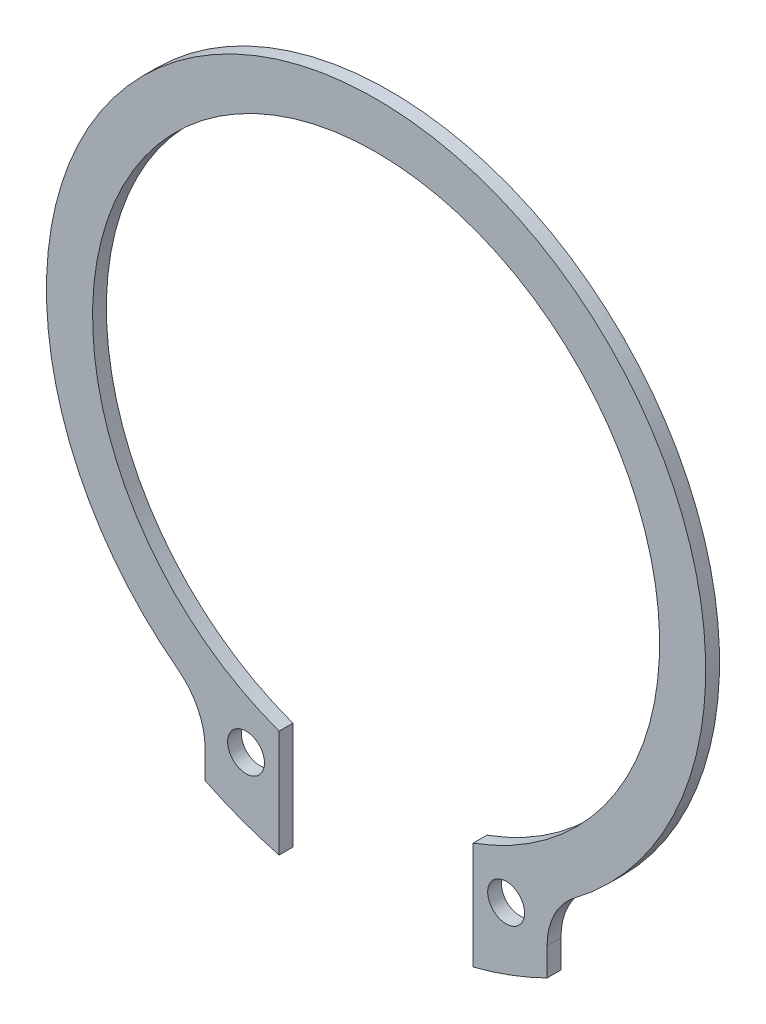
ISO-10303-21;
HEADER;
FILE_DESCRIPTION(('STEP AP214'),'2;1');
FILE_NAME('part.step','',(''),(''),'','','');
FILE_SCHEMA(('AUTOMOTIVE_DESIGN { 1 0 10303 214 1 1 1 1 }'));
ENDSEC;
DATA;
#1=APPLICATION_CONTEXT('core data for automotive mechanical design processes');
#2=APPLICATION_PROTOCOL_DEFINITION('international standard','automotive_design',2000,#1);
#3=PRODUCT_CONTEXT('',#1,'mechanical');
#4=PRODUCT('Part','Part','',(#3));
#5=PRODUCT_RELATED_PRODUCT_CATEGORY('part','',(#4));
#6=PRODUCT_DEFINITION_FORMATION('','',#4);
#7=PRODUCT_DEFINITION_CONTEXT('part definition',#1,'design');
#8=PRODUCT_DEFINITION('design','',#6,#7);
#9=PRODUCT_DEFINITION_SHAPE('','',#8);
#10=(LENGTH_UNIT() NAMED_UNIT(*) SI_UNIT(.MILLI.,.METRE.));
#11=(NAMED_UNIT(*) PLANE_ANGLE_UNIT() SI_UNIT($,.RADIAN.));
#12=(NAMED_UNIT(*) SI_UNIT($,.STERADIAN.) SOLID_ANGLE_UNIT());
#13=UNCERTAINTY_MEASURE_WITH_UNIT(LENGTH_MEASURE(1.E-05),#10,'distance_accuracy_value','');
#14=(GEOMETRIC_REPRESENTATION_CONTEXT(3) GLOBAL_UNCERTAINTY_ASSIGNED_CONTEXT((#13)) GLOBAL_UNIT_ASSIGNED_CONTEXT((#10,
#11,#12)) REPRESENTATION_CONTEXT('',''));
#15=CARTESIAN_POINT('',(0.,0.,0.));
#16=DIRECTION('',(0.,0.,1.));
#17=DIRECTION('',(1.,0.,0.));
#18=AXIS2_PLACEMENT_3D('',#15,#16,#17);
#19=CARTESIAN_POINT('',(-52.0911801090187,-69.0562014221009,3.));
#20=DIRECTION('',(0.,0.,1.));
#21=DIRECTION('',(1.,0.,0.));
#22=AXIS2_PLACEMENT_3D('',#19,#20,#21);
#23=PLANE('',#22);
#24=CARTESIAN_POINT('',(-28.2027034477095,-65.3715453780829,3.));
#25=DIRECTION('',(0.,0.,1.));
#26=DIRECTION('',(1.,0.,0.));
#27=AXIS2_PLACEMENT_3D('',#24,#25,#26);
#28=CIRCLE('',#27,4.);
#29=CARTESIAN_POINT('',(-24.2027034477095,-65.3715453780829,3.));
#30=VERTEX_POINT('',#29);
#31=EDGE_CURVE('E148',#30,#30,#28,.T.);
#32=ORIENTED_EDGE('',*,*,#31,.F.);
#33=EDGE_LOOP('',(#32));
#34=FACE_BOUND('',#33,.T.);
#35=CARTESIAN_POINT('',(-52.0911801090187,-69.0562014221009,3.));
#36=DIRECTION('',(0.,0.,-1.));
#37=DIRECTION('',(1.,0.,0.));
#38=AXIS2_PLACEMENT_3D('',#35,#36,#37);
#39=CIRCLE('',#38,15.);
#40=CARTESIAN_POINT('',(-43.0580274889577,-57.0811375916787,3.));
#41=VERTEX_POINT('',#40);
#42=CARTESIAN_POINT('',(-37.0911801090187,-69.0562014221009,3.));
#43=VERTEX_POINT('',#42);
#44=EDGE_CURVE('E163',#41,#43,#39,.T.);
#45=ORIENTED_EDGE('',*,*,#44,.T.);
#46=DIRECTION('',(0.,-1.,0.));
#47=VECTOR('',#46,1.);
#48=CARTESIAN_POINT('',(-37.0911801090187,-75.0960801482049,3.));
#49=LINE('',#48,#47);
#50=CARTESIAN_POINT('',(-37.0911801090187,-75.0960801482049,3.));
#51=VERTEX_POINT('',#50);
#52=EDGE_CURVE('E101',#43,#51,#49,.T.);
#53=ORIENTED_EDGE('',*,*,#52,.T.);
#54=CARTESIAN_POINT('',(0.,0.,3.));
#55=DIRECTION('',(0.,0.,1.));
#56=DIRECTION('',(-1.,0.,0.));
#57=AXIS2_PLACEMENT_3D('',#54,#55,#56);
#58=CIRCLE('',#57,83.7566528432535);
#59=CARTESIAN_POINT('',(-21.0342388145287,-81.0724225183796,3.));
#60=VERTEX_POINT('',#59);
#61=EDGE_CURVE('E184',#51,#60,#58,.T.);
#62=ORIENTED_EDGE('',*,*,#61,.T.);
#63=DIRECTION('',(0.,1.,0.));
#64=VECTOR('',#63,1.);
#65=CARTESIAN_POINT('',(-21.0342388145287,-57.7910961783334,3.));
#66=LINE('',#65,#64);
#67=CARTESIAN_POINT('',(-21.0342388145287,-57.7910961783334,3.));
#68=VERTEX_POINT('',#67);
#69=EDGE_CURVE('E203',#60,#68,#66,.T.);
#70=ORIENTED_EDGE('',*,*,#69,.T.);
#71=CARTESIAN_POINT('',(0.,0.,3.));
#72=DIRECTION('',(0.,0.,-1.));
#73=DIRECTION('',(1.,0.,0.));
#74=AXIS2_PLACEMENT_3D('',#71,#72,#73);
#75=CIRCLE('',#74,61.5);
#76=CARTESIAN_POINT('',(21.0342388145286,-57.7910961783334,3.));
#77=VERTEX_POINT('',#76);
#78=EDGE_CURVE('E200',#68,#77,#75,.T.);
#79=ORIENTED_EDGE('',*,*,#78,.T.);
#80=DIRECTION('',(0.,-1.,0.));
#81=VECTOR('',#80,1.);
#82=CARTESIAN_POINT('',(21.0342388145287,-57.7910961783334,3.));
#83=LINE('',#82,#81);
#84=CARTESIAN_POINT('',(21.0342388145287,-81.0724225183796,3.));
#85=VERTEX_POINT('',#84);
#86=EDGE_CURVE('E202',#77,#85,#83,.T.);
#87=ORIENTED_EDGE('',*,*,#86,.T.);
#88=CARTESIAN_POINT('',(0.,0.,3.));
#89=DIRECTION('',(0.,0.,1.));
#90=DIRECTION('',(1.,0.,0.));
#91=AXIS2_PLACEMENT_3D('',#88,#89,#90);
#92=CIRCLE('',#91,83.7566528432535);
#93=CARTESIAN_POINT('',(37.0911801090187,-75.0960801482049,3.));
#94=VERTEX_POINT('',#93);
#95=EDGE_CURVE('E126',#85,#94,#92,.T.);
#96=ORIENTED_EDGE('',*,*,#95,.T.);
#97=DIRECTION('',(0.,1.,0.));
#98=VECTOR('',#97,1.);
#99=CARTESIAN_POINT('',(37.0911801090187,-75.0960801482049,3.));
#100=LINE('',#99,#98);
#101=CARTESIAN_POINT('',(37.0911801090187,-69.0562014221009,3.));
#102=VERTEX_POINT('',#101);
#103=EDGE_CURVE('E120',#94,#102,#100,.T.);
#104=ORIENTED_EDGE('',*,*,#103,.T.);
#105=CARTESIAN_POINT('',(52.0911801090187,-69.0562014221009,3.));
#106=DIRECTION('',(0.,0.,-1.));
#107=DIRECTION('',(-1.,0.,0.));
#108=AXIS2_PLACEMENT_3D('',#105,#106,#107);
#109=CIRCLE('',#108,15.);
#110=CARTESIAN_POINT('',(43.0580274889577,-57.0811375916788,3.));
#111=VERTEX_POINT('',#110);
#112=EDGE_CURVE('E124',#102,#111,#109,.T.);
#113=ORIENTED_EDGE('',*,*,#112,.T.);
#114=CARTESIAN_POINT('',(0.,0.,3.));
#115=DIRECTION('',(0.,0.,1.));
#116=DIRECTION('',(1.,0.,0.));
#117=AXIS2_PLACEMENT_3D('',#114,#115,#116);
#118=CIRCLE('',#117,71.5);
#119=EDGE_CURVE('E52',#111,#41,#118,.T.);
#120=ORIENTED_EDGE('',*,*,#119,.T.);
#121=EDGE_LOOP('',(#45,#53,#62,#70,#79,#87,#96,#104,#113,#120));
#122=FACE_BOUND('',#121,.T.);
#123=CARTESIAN_POINT('',(28.2027034477095,-65.3715453780829,3.));
#124=DIRECTION('',(0.,0.,1.));
#125=DIRECTION('',(-1.,0.,0.));
#126=AXIS2_PLACEMENT_3D('',#123,#124,#125);
#127=CIRCLE('',#126,4.);
#128=CARTESIAN_POINT('',(24.2027034477095,-65.3715453780829,3.));
#129=VERTEX_POINT('',#128);
#130=EDGE_CURVE('E214',#129,#129,#127,.T.);
#131=ORIENTED_EDGE('',*,*,#130,.F.);
#132=EDGE_LOOP('',(#131));
#133=FACE_BOUND('',#132,.T.);
#134=ADVANCED_FACE('F35',(#34,#122,#133),#23,.T.);
#135=CARTESIAN_POINT('',(-52.0911801090187,-69.0562014221009,0.));
#136=DIRECTION('',(0.,0.,1.));
#137=DIRECTION('',(1.,0.,0.));
#138=AXIS2_PLACEMENT_3D('',#135,#136,#137);
#139=PLANE('',#138);
#140=CARTESIAN_POINT('',(-52.0911801090187,-69.0562014221009,0.));
#141=DIRECTION('',(0.,0.,-1.));
#142=DIRECTION('',(1.,0.,0.));
#143=AXIS2_PLACEMENT_3D('',#140,#141,#142);
#144=CIRCLE('',#143,15.);
#145=CARTESIAN_POINT('',(-43.0580274889577,-57.0811375916787,0.));
#146=VERTEX_POINT('',#145);
#147=CARTESIAN_POINT('',(-37.0911801090187,-69.0562014221009,0.));
#148=VERTEX_POINT('',#147);
#149=EDGE_CURVE('E144',#146,#148,#144,.T.);
#150=ORIENTED_EDGE('',*,*,#149,.F.);
#151=CARTESIAN_POINT('',(0.,0.,0.));
#152=DIRECTION('',(0.,0.,1.));
#153=DIRECTION('',(1.,0.,0.));
#154=AXIS2_PLACEMENT_3D('',#151,#152,#153);
#155=CIRCLE('',#154,71.5);
#156=CARTESIAN_POINT('',(43.0580274889577,-57.0811375916788,0.));
#157=VERTEX_POINT('',#156);
#158=EDGE_CURVE('E93',#157,#146,#155,.T.);
#159=ORIENTED_EDGE('',*,*,#158,.F.);
#160=CARTESIAN_POINT('',(52.0911801090187,-69.0562014221009,0.));
#161=DIRECTION('',(0.,0.,-1.));
#162=DIRECTION('',(-1.,0.,0.));
#163=AXIS2_PLACEMENT_3D('',#160,#161,#162);
#164=CIRCLE('',#163,15.);
#165=CARTESIAN_POINT('',(37.0911801090187,-69.0562014221009,0.));
#166=VERTEX_POINT('',#165);
#167=EDGE_CURVE('E87',#166,#157,#164,.T.);
#168=ORIENTED_EDGE('',*,*,#167,.F.);
#169=DIRECTION('',(0.,1.,0.));
#170=VECTOR('',#169,1.);
#171=CARTESIAN_POINT('',(37.0911801090187,-75.0960801482049,0.));
#172=LINE('',#171,#170);
#173=CARTESIAN_POINT('',(37.0911801090187,-75.0960801482049,0.));
#174=VERTEX_POINT('',#173);
#175=EDGE_CURVE('E134',#174,#166,#172,.T.);
#176=ORIENTED_EDGE('',*,*,#175,.F.);
#177=CARTESIAN_POINT('',(0.,0.,0.));
#178=DIRECTION('',(0.,0.,1.));
#179=DIRECTION('',(1.,0.,0.));
#180=AXIS2_PLACEMENT_3D('',#177,#178,#179);
#181=CIRCLE('',#180,83.7566528432535);
#182=CARTESIAN_POINT('',(21.0342388145287,-81.0724225183796,0.));
#183=VERTEX_POINT('',#182);
#184=EDGE_CURVE('E158',#183,#174,#181,.T.);
#185=ORIENTED_EDGE('',*,*,#184,.F.);
#186=DIRECTION('',(0.,-1.,0.));
#187=VECTOR('',#186,1.);
#188=CARTESIAN_POINT('',(21.0342388145287,-57.7910961783334,0.));
#189=LINE('',#188,#187);
#190=CARTESIAN_POINT('',(21.0342388145286,-57.7910961783334,0.));
#191=VERTEX_POINT('',#190);
#192=EDGE_CURVE('E156',#191,#183,#189,.T.);
#193=ORIENTED_EDGE('',*,*,#192,.F.);
#194=CARTESIAN_POINT('',(0.,0.,0.));
#195=DIRECTION('',(0.,0.,-1.));
#196=DIRECTION('',(1.,0.,0.));
#197=AXIS2_PLACEMENT_3D('',#194,#195,#196);
#198=CIRCLE('',#197,61.5);
#199=CARTESIAN_POINT('',(-21.0342388145287,-57.7910961783334,0.));
#200=VERTEX_POINT('',#199);
#201=EDGE_CURVE('E154',#200,#191,#198,.T.);
#202=ORIENTED_EDGE('',*,*,#201,.F.);
#203=DIRECTION('',(0.,1.,0.));
#204=VECTOR('',#203,1.);
#205=CARTESIAN_POINT('',(-21.0342388145287,-57.7910961783334,0.));
#206=LINE('',#205,#204);
#207=CARTESIAN_POINT('',(-21.0342388145287,-81.0724225183796,0.));
#208=VERTEX_POINT('',#207);
#209=EDGE_CURVE('E152',#208,#200,#206,.T.);
#210=ORIENTED_EDGE('',*,*,#209,.F.);
#211=CARTESIAN_POINT('',(0.,0.,0.));
#212=DIRECTION('',(0.,0.,1.));
#213=DIRECTION('',(-1.,0.,0.));
#214=AXIS2_PLACEMENT_3D('',#211,#212,#213);
#215=CIRCLE('',#214,83.7566528432535);
#216=CARTESIAN_POINT('',(-37.0911801090187,-75.0960801482049,0.));
#217=VERTEX_POINT('',#216);
#218=EDGE_CURVE('E150',#217,#208,#215,.T.);
#219=ORIENTED_EDGE('',*,*,#218,.F.);
#220=DIRECTION('',(0.,-1.,0.));
#221=VECTOR('',#220,1.);
#222=CARTESIAN_POINT('',(-37.0911801090187,-75.0960801482049,0.));
#223=LINE('',#222,#221);
#224=EDGE_CURVE('E147',#148,#217,#223,.T.);
#225=ORIENTED_EDGE('',*,*,#224,.F.);
#226=EDGE_LOOP('',(#150,#159,#168,#176,#185,#193,#202,#210,#219,#225));
#227=FACE_BOUND('',#226,.T.);
#228=CARTESIAN_POINT('',(-28.2027034477095,-65.3715453780829,0.));
#229=DIRECTION('',(0.,0.,1.));
#230=DIRECTION('',(1.,0.,0.));
#231=AXIS2_PLACEMENT_3D('',#228,#229,#230);
#232=CIRCLE('',#231,4.);
#233=CARTESIAN_POINT('',(-24.2027034477095,-65.3715453780829,0.));
#234=VERTEX_POINT('',#233);
#235=EDGE_CURVE('E211',#234,#234,#232,.T.);
#236=ORIENTED_EDGE('',*,*,#235,.T.);
#237=EDGE_LOOP('',(#236));
#238=FACE_BOUND('',#237,.T.);
#239=CARTESIAN_POINT('',(28.2027034477095,-65.3715453780829,0.));
#240=DIRECTION('',(0.,0.,1.));
#241=DIRECTION('',(-1.,0.,0.));
#242=AXIS2_PLACEMENT_3D('',#239,#240,#241);
#243=CIRCLE('',#242,4.);
#244=CARTESIAN_POINT('',(24.2027034477095,-65.3715453780829,0.));
#245=VERTEX_POINT('',#244);
#246=EDGE_CURVE('E217',#245,#245,#243,.T.);
#247=ORIENTED_EDGE('',*,*,#246,.T.);
#248=EDGE_LOOP('',(#247));
#249=FACE_BOUND('',#248,.T.);
#250=ADVANCED_FACE('F188',(#227,#238,#249),#139,.F.);
#251=CARTESIAN_POINT('',(-52.0911801090187,-69.0562014221009,3.));
#252=DIRECTION('',(0.,0.,-1.));
#253=DIRECTION('',(-1.,0.,0.));
#254=AXIS2_PLACEMENT_3D('',#251,#252,#253);
#255=CYLINDRICAL_SURFACE('',#254,15.);
#256=ORIENTED_EDGE('',*,*,#149,.T.);
#257=DIRECTION('',(0.,0.,-1.));
#258=VECTOR('',#257,1.);
#259=CARTESIAN_POINT('',(-37.0911801090187,-69.0562014221009,3.));
#260=LINE('',#259,#258);
#261=EDGE_CURVE('E11',#43,#148,#260,.T.);
#262=ORIENTED_EDGE('',*,*,#261,.F.);
#263=ORIENTED_EDGE('',*,*,#44,.F.);
#264=DIRECTION('',(0.,0.,-1.));
#265=VECTOR('',#264,1.);
#266=CARTESIAN_POINT('',(-43.0580274889577,-57.0811375916787,3.));
#267=LINE('',#266,#265);
#268=EDGE_CURVE('E140',#41,#146,#267,.T.);
#269=ORIENTED_EDGE('',*,*,#268,.T.);
#270=EDGE_LOOP('',(#256,#262,#263,#269));
#271=FACE_BOUND('',#270,.T.);
#272=ADVANCED_FACE('F37',(#271),#255,.F.);
#273=CARTESIAN_POINT('',(-37.0911801090187,-75.0960801482049,3.));
#274=DIRECTION('',(1.,0.,0.));
#275=DIRECTION('',(0.,0.,-1.));
#276=AXIS2_PLACEMENT_3D('',#273,#274,#275);
#277=PLANE('',#276);
#278=ORIENTED_EDGE('',*,*,#224,.T.);
#279=DIRECTION('',(0.,0.,-1.));
#280=VECTOR('',#279,1.);
#281=CARTESIAN_POINT('',(-37.0911801090187,-75.0960801482049,3.));
#282=LINE('',#281,#280);
#283=EDGE_CURVE('E44',#51,#217,#282,.T.);
#284=ORIENTED_EDGE('',*,*,#283,.F.);
#285=ORIENTED_EDGE('',*,*,#52,.F.);
#286=ORIENTED_EDGE('',*,*,#261,.T.);
#287=EDGE_LOOP('',(#278,#284,#285,#286));
#288=FACE_BOUND('',#287,.T.);
#289=ADVANCED_FACE('F257',(#288),#277,.F.);
#290=CARTESIAN_POINT('',(0.,0.,3.));
#291=DIRECTION('',(0.,0.,-1.));
#292=DIRECTION('',(-1.,0.,0.));
#293=AXIS2_PLACEMENT_3D('',#290,#291,#292);
#294=CYLINDRICAL_SURFACE('',#293,83.7566528432535);
#295=ORIENTED_EDGE('',*,*,#218,.T.);
#296=DIRECTION('',(0.,0.,-1.));
#297=VECTOR('',#296,1.);
#298=CARTESIAN_POINT('',(-21.0342388145287,-81.0724225183796,3.));
#299=LINE('',#298,#297);
#300=EDGE_CURVE('E176',#60,#208,#299,.T.);
#301=ORIENTED_EDGE('',*,*,#300,.F.);
#302=ORIENTED_EDGE('',*,*,#61,.F.);
#303=ORIENTED_EDGE('',*,*,#283,.T.);
#304=EDGE_LOOP('',(#295,#301,#302,#303));
#305=FACE_BOUND('',#304,.T.);
#306=ADVANCED_FACE('F182',(#305),#294,.T.);
#307=CARTESIAN_POINT('',(-21.0342388145287,-57.7910961783334,3.));
#308=DIRECTION('',(-1.,0.,0.));
#309=DIRECTION('',(0.,0.,1.));
#310=AXIS2_PLACEMENT_3D('',#307,#308,#309);
#311=PLANE('',#310);
#312=ORIENTED_EDGE('',*,*,#209,.T.);
#313=DIRECTION('',(0.,0.,-1.));
#314=VECTOR('',#313,1.);
#315=CARTESIAN_POINT('',(-21.0342388145287,-57.7910961783334,3.));
#316=LINE('',#315,#314);
#317=EDGE_CURVE('E173',#68,#200,#316,.T.);
#318=ORIENTED_EDGE('',*,*,#317,.F.);
#319=ORIENTED_EDGE('',*,*,#69,.F.);
#320=ORIENTED_EDGE('',*,*,#300,.T.);
#321=EDGE_LOOP('',(#312,#318,#319,#320));
#322=FACE_BOUND('',#321,.T.);
#323=ADVANCED_FACE('F194',(#322),#311,.F.);
#324=CARTESIAN_POINT('',(0.,0.,3.));
#325=DIRECTION('',(0.,0.,-1.));
#326=DIRECTION('',(-1.,0.,0.));
#327=AXIS2_PLACEMENT_3D('',#324,#325,#326);
#328=CYLINDRICAL_SURFACE('',#327,61.5);
#329=ORIENTED_EDGE('',*,*,#201,.T.);
#330=DIRECTION('',(0.,0.,-1.));
#331=VECTOR('',#330,1.);
#332=CARTESIAN_POINT('',(21.0342388145286,-57.7910961783334,3.));
#333=LINE('',#332,#331);
#334=EDGE_CURVE('E170',#77,#191,#333,.T.);
#335=ORIENTED_EDGE('',*,*,#334,.F.);
#336=ORIENTED_EDGE('',*,*,#78,.F.);
#337=ORIENTED_EDGE('',*,*,#317,.T.);
#338=EDGE_LOOP('',(#329,#335,#336,#337));
#339=FACE_BOUND('',#338,.T.);
#340=ADVANCED_FACE('F198',(#339),#328,.F.);
#341=CARTESIAN_POINT('',(21.0342388145287,-57.7910961783334,3.));
#342=DIRECTION('',(1.,0.,0.));
#343=DIRECTION('',(0.,0.,-1.));
#344=AXIS2_PLACEMENT_3D('',#341,#342,#343);
#345=PLANE('',#344);
#346=ORIENTED_EDGE('',*,*,#192,.T.);
#347=DIRECTION('',(0.,0.,-1.));
#348=VECTOR('',#347,1.);
#349=CARTESIAN_POINT('',(21.0342388145287,-81.0724225183796,3.));
#350=LINE('',#349,#348);
#351=EDGE_CURVE('E167',#85,#183,#350,.T.);
#352=ORIENTED_EDGE('',*,*,#351,.F.);
#353=ORIENTED_EDGE('',*,*,#86,.F.);
#354=ORIENTED_EDGE('',*,*,#334,.T.);
#355=EDGE_LOOP('',(#346,#352,#353,#354));
#356=FACE_BOUND('',#355,.T.);
#357=ADVANCED_FACE('F247',(#356),#345,.F.);
#358=CARTESIAN_POINT('',(0.,0.,3.));
#359=DIRECTION('',(0.,0.,-1.));
#360=DIRECTION('',(-1.,0.,0.));
#361=AXIS2_PLACEMENT_3D('',#358,#359,#360);
#362=CYLINDRICAL_SURFACE('',#361,83.7566528432535);
#363=ORIENTED_EDGE('',*,*,#184,.T.);
#364=DIRECTION('',(0.,0.,-1.));
#365=VECTOR('',#364,1.);
#366=CARTESIAN_POINT('',(37.0911801090187,-75.0960801482049,3.));
#367=LINE('',#366,#365);
#368=EDGE_CURVE('E135',#94,#174,#367,.T.);
#369=ORIENTED_EDGE('',*,*,#368,.F.);
#370=ORIENTED_EDGE('',*,*,#95,.F.);
#371=ORIENTED_EDGE('',*,*,#351,.T.);
#372=EDGE_LOOP('',(#363,#369,#370,#371));
#373=FACE_BOUND('',#372,.T.);
#374=ADVANCED_FACE('F244',(#373),#362,.T.);
#375=CARTESIAN_POINT('',(37.0911801090187,-75.0960801482049,3.));
#376=DIRECTION('',(-1.,0.,0.));
#377=DIRECTION('',(0.,0.,1.));
#378=AXIS2_PLACEMENT_3D('',#375,#376,#377);
#379=PLANE('',#378);
#380=ORIENTED_EDGE('',*,*,#175,.T.);
#381=DIRECTION('',(0.,0.,-1.));
#382=VECTOR('',#381,1.);
#383=CARTESIAN_POINT('',(37.0911801090187,-69.0562014221009,3.));
#384=LINE('',#383,#382);
#385=EDGE_CURVE('E131',#102,#166,#384,.T.);
#386=ORIENTED_EDGE('',*,*,#385,.F.);
#387=ORIENTED_EDGE('',*,*,#103,.F.);
#388=ORIENTED_EDGE('',*,*,#368,.T.);
#389=EDGE_LOOP('',(#380,#386,#387,#388));
#390=FACE_BOUND('',#389,.T.);
#391=ADVANCED_FACE('F132',(#390),#379,.F.);
#392=CARTESIAN_POINT('',(52.0911801090187,-69.0562014221009,3.));
#393=DIRECTION('',(0.,0.,-1.));
#394=DIRECTION('',(-1.,0.,0.));
#395=AXIS2_PLACEMENT_3D('',#392,#393,#394);
#396=CYLINDRICAL_SURFACE('',#395,15.);
#397=ORIENTED_EDGE('',*,*,#167,.T.);
#398=DIRECTION('',(0.,0.,-1.));
#399=VECTOR('',#398,1.);
#400=CARTESIAN_POINT('',(43.0580274889577,-57.0811375916788,3.));
#401=LINE('',#400,#399);
#402=EDGE_CURVE('E136',#111,#157,#401,.T.);
#403=ORIENTED_EDGE('',*,*,#402,.F.);
#404=ORIENTED_EDGE('',*,*,#112,.F.);
#405=ORIENTED_EDGE('',*,*,#385,.T.);
#406=EDGE_LOOP('',(#397,#403,#404,#405));
#407=FACE_BOUND('',#406,.T.);
#408=ADVANCED_FACE('F138',(#407),#396,.F.);
#409=CARTESIAN_POINT('',(0.,0.,3.));
#410=DIRECTION('',(0.,0.,-1.));
#411=DIRECTION('',(-1.,0.,0.));
#412=AXIS2_PLACEMENT_3D('',#409,#410,#411);
#413=CYLINDRICAL_SURFACE('',#412,71.5);
#414=ORIENTED_EDGE('',*,*,#158,.T.);
#415=ORIENTED_EDGE('',*,*,#268,.F.);
#416=ORIENTED_EDGE('',*,*,#119,.F.);
#417=ORIENTED_EDGE('',*,*,#402,.T.);
#418=EDGE_LOOP('',(#414,#415,#416,#417));
#419=FACE_BOUND('',#418,.T.);
#420=ADVANCED_FACE('F237',(#419),#413,.T.);
#421=CARTESIAN_POINT('',(-28.2027034477095,-65.3715453780829,3.));
#422=DIRECTION('',(0.,0.,-1.));
#423=DIRECTION('',(-1.,0.,0.));
#424=AXIS2_PLACEMENT_3D('',#421,#422,#423);
#425=CYLINDRICAL_SURFACE('',#424,4.);
#426=ORIENTED_EDGE('',*,*,#31,.T.);
#427=EDGE_LOOP('',(#426));
#428=FACE_BOUND('',#427,.T.);
#429=ORIENTED_EDGE('',*,*,#235,.F.);
#430=EDGE_LOOP('',(#429));
#431=FACE_BOUND('',#430,.T.);
#432=ADVANCED_FACE('F234',(#428,#431),#425,.F.);
#433=CARTESIAN_POINT('',(28.2027034477095,-65.3715453780829,3.));
#434=DIRECTION('',(0.,0.,-1.));
#435=DIRECTION('',(-1.,0.,0.));
#436=AXIS2_PLACEMENT_3D('',#433,#434,#435);
#437=CYLINDRICAL_SURFACE('',#436,4.);
#438=ORIENTED_EDGE('',*,*,#130,.T.);
#439=EDGE_LOOP('',(#438));
#440=FACE_BOUND('',#439,.T.);
#441=ORIENTED_EDGE('',*,*,#246,.F.);
#442=EDGE_LOOP('',(#441));
#443=FACE_BOUND('',#442,.T.);
#444=ADVANCED_FACE('F223',(#440,#443),#437,.F.);
#445=CLOSED_SHELL('',(#134,#250,#272,#289,#306,#323,#340,#357,#374,#391,#408,#420,#432,#444));
#446=MANIFOLD_SOLID_BREP('B2',#445);
#447=ADVANCED_BREP_SHAPE_REPRESENTATION('',(#18,#446),#14);
#448=SHAPE_DEFINITION_REPRESENTATION(#9,#447);
ENDSEC;
END-ISO-10303-21;
